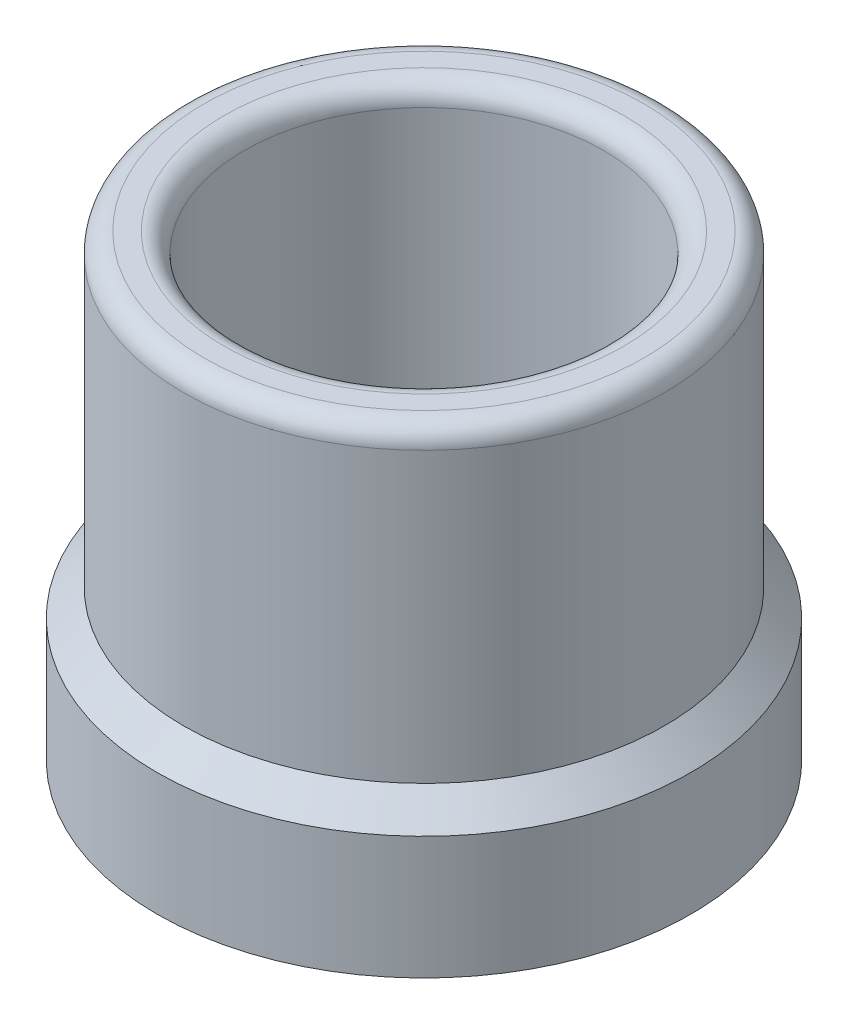
ISO-10303-21;
HEADER;
FILE_DESCRIPTION(('STEP AP214'),'2;1');
FILE_NAME('part.step','',(''),(''),'','','');
FILE_SCHEMA(('AUTOMOTIVE_DESIGN { 1 0 10303 214 1 1 1 1 }'));
ENDSEC;
DATA;
#1=APPLICATION_CONTEXT('core data for automotive mechanical design processes');
#2=APPLICATION_PROTOCOL_DEFINITION('international standard','automotive_design',2000,#1);
#3=PRODUCT_CONTEXT('',#1,'mechanical');
#4=PRODUCT('Part','Part','',(#3));
#5=PRODUCT_RELATED_PRODUCT_CATEGORY('part','',(#4));
#6=PRODUCT_DEFINITION_FORMATION('','',#4);
#7=PRODUCT_DEFINITION_CONTEXT('part definition',#1,'design');
#8=PRODUCT_DEFINITION('design','',#6,#7);
#9=PRODUCT_DEFINITION_SHAPE('','',#8);
#10=(LENGTH_UNIT() NAMED_UNIT(*) SI_UNIT(.MILLI.,.METRE.));
#11=(NAMED_UNIT(*) PLANE_ANGLE_UNIT() SI_UNIT($,.RADIAN.));
#12=(NAMED_UNIT(*) SI_UNIT($,.STERADIAN.) SOLID_ANGLE_UNIT());
#13=UNCERTAINTY_MEASURE_WITH_UNIT(LENGTH_MEASURE(1.E-05),#10,'distance_accuracy_value','');
#14=(GEOMETRIC_REPRESENTATION_CONTEXT(3) GLOBAL_UNCERTAINTY_ASSIGNED_CONTEXT((#13)) GLOBAL_UNIT_ASSIGNED_CONTEXT((#10,
#11,#12)) REPRESENTATION_CONTEXT('',''));
#15=CARTESIAN_POINT('',(0.,0.,0.));
#16=DIRECTION('',(0.,0.,1.));
#17=DIRECTION('',(1.,0.,0.));
#18=AXIS2_PLACEMENT_3D('',#15,#16,#17);
#19=CARTESIAN_POINT('',(-26.,94.7,-3.5));
#20=DIRECTION('',(0.,-1.,0.));
#21=DIRECTION('',(0.,0.,-1.));
#22=AXIS2_PLACEMENT_3D('',#19,#20,#21);
#23=TOROIDAL_SURFACE('',#22,4.60870569763346,0.5);
#24=CARTESIAN_POINT('',(-26.,94.7,-3.5));
#25=DIRECTION('',(0.,-1.,0.));
#26=DIRECTION('',(0.,0.,-1.));
#27=AXIS2_PLACEMENT_3D('',#24,#25,#26);
#28=CIRCLE('',#27,4.10870569763346);
#29=CARTESIAN_POINT('',(-26.,94.7,-7.60870569763345));
#30=VERTEX_POINT('',#29);
#31=EDGE_CURVE('E291',#30,#30,#28,.T.);
#32=ORIENTED_EDGE('',*,*,#31,.F.);
#33=EDGE_LOOP('',(#32));
#34=FACE_BOUND('',#33,.T.);
#35=CARTESIAN_POINT('',(-26.,94.7,-3.5));
#36=DIRECTION('',(0.,-1.,0.));
#37=DIRECTION('',(0.,0.,-1.));
#38=AXIS2_PLACEMENT_3D('',#35,#36,#37);
#39=CIRCLE('',#38,5.10870569763346);
#40=CARTESIAN_POINT('',(-26.,94.7,-8.60870569763346));
#41=VERTEX_POINT('',#40);
#42=EDGE_CURVE('E101',#41,#41,#39,.T.);
#43=ORIENTED_EDGE('',*,*,#42,.T.);
#44=EDGE_LOOP('',(#43));
#45=FACE_BOUND('',#44,.T.);
#46=ADVANCED_FACE('F47',(#34,#45),#23,.F.);
#47=CARTESIAN_POINT('',(-26.,90.5,-3.5));
#48=DIRECTION('',(0.,-1.,0.));
#49=DIRECTION('',(0.,0.,-1.));
#50=AXIS2_PLACEMENT_3D('',#47,#48,#49);
#51=CYLINDRICAL_SURFACE('',#50,5.10870569763346);
#52=CARTESIAN_POINT('',(-26.,92.5,-3.5));
#53=DIRECTION('',(0.,-1.,0.));
#54=DIRECTION('',(0.,0.,-1.));
#55=AXIS2_PLACEMENT_3D('',#52,#53,#54);
#56=CIRCLE('',#55,5.10870569763346);
#57=CARTESIAN_POINT('',(-26.,92.5,-8.60870569763346));
#58=VERTEX_POINT('',#57);
#59=EDGE_CURVE('E105',#58,#58,#56,.T.);
#60=ORIENTED_EDGE('',*,*,#59,.T.);
#61=EDGE_LOOP('',(#60));
#62=FACE_BOUND('',#61,.T.);
#63=ORIENTED_EDGE('',*,*,#42,.F.);
#64=EDGE_LOOP('',(#63));
#65=FACE_BOUND('',#64,.T.);
#66=ADVANCED_FACE('F139',(#62,#65),#51,.F.);
#67=CARTESIAN_POINT('',(-26.,93.5,-3.5));
#68=DIRECTION('',(0.,-1.,0.));
#69=DIRECTION('',(0.,0.,-1.));
#70=AXIS2_PLACEMENT_3D('',#67,#68,#69);
#71=TOROIDAL_SURFACE('',#70,5.85870569763346,1.25);
#72=ORIENTED_EDGE('',*,*,#59,.F.);
#73=EDGE_LOOP('',(#72));
#74=FACE_BOUND('',#73,.T.);
#75=CARTESIAN_POINT('',(-26.,92.5,-3.5));
#76=DIRECTION('',(0.,-1.,0.));
#77=DIRECTION('',(0.,0.,-1.));
#78=AXIS2_PLACEMENT_3D('',#75,#76,#77);
#79=CIRCLE('',#78,6.60870569763346);
#80=CARTESIAN_POINT('',(-26.,92.5,-10.1087056976335));
#81=VERTEX_POINT('',#80);
#82=EDGE_CURVE('E109',#81,#81,#79,.T.);
#83=ORIENTED_EDGE('',*,*,#82,.T.);
#84=EDGE_LOOP('',(#83));
#85=FACE_BOUND('',#84,.T.);
#86=ADVANCED_FACE('F145',(#74,#85),#71,.T.);
#87=CARTESIAN_POINT('',(-26.,90.5,-3.5));
#88=DIRECTION('',(0.,-1.,0.));
#89=DIRECTION('',(0.,0.,-1.));
#90=AXIS2_PLACEMENT_3D('',#87,#88,#89);
#91=CYLINDRICAL_SURFACE('',#90,6.60870569763346);
#92=ORIENTED_EDGE('',*,*,#82,.F.);
#93=EDGE_LOOP('',(#92));
#94=FACE_BOUND('',#93,.T.);
#95=CARTESIAN_POINT('',(-26.,95.5362943023666,-3.5));
#96=DIRECTION('',(0.,-1.,0.));
#97=DIRECTION('',(0.,0.,-1.));
#98=AXIS2_PLACEMENT_3D('',#95,#96,#97);
#99=CIRCLE('',#98,6.60870569763346);
#100=CARTESIAN_POINT('',(-26.,95.5362943023666,-10.1087056976335));
#101=VERTEX_POINT('',#100);
#102=EDGE_CURVE('E113',#101,#101,#99,.T.);
#103=ORIENTED_EDGE('',*,*,#102,.T.);
#104=EDGE_LOOP('',(#103));
#105=FACE_BOUND('',#104,.T.);
#106=ADVANCED_FACE('F134',(#94,#105),#91,.T.);
#107=CARTESIAN_POINT('',(-26.,96.2,-3.5));
#108=DIRECTION('',(0.,-1.,0.));
#109=DIRECTION('',(0.,0.,-1.));
#110=AXIS2_PLACEMENT_3D('',#107,#108,#109);
#111=CONICAL_SURFACE('',#110,5.945,0.785398163397464);
#112=ORIENTED_EDGE('',*,*,#102,.F.);
#113=EDGE_LOOP('',(#112));
#114=FACE_BOUND('',#113,.T.);
#115=CARTESIAN_POINT('',(-26.,96.2,-3.5));
#116=DIRECTION('',(0.,-1.,0.));
#117=DIRECTION('',(0.,0.,-1.));
#118=AXIS2_PLACEMENT_3D('',#115,#116,#117);
#119=CIRCLE('',#118,5.945);
#120=CARTESIAN_POINT('',(-26.,96.2,-9.445));
#121=VERTEX_POINT('',#120);
#122=EDGE_CURVE('E97',#121,#121,#119,.T.);
#123=ORIENTED_EDGE('',*,*,#122,.T.);
#124=EDGE_LOOP('',(#123));
#125=FACE_BOUND('',#124,.T.);
#126=ADVANCED_FACE('F121',(#114,#125),#111,.T.);
#127=CARTESIAN_POINT('',(-26.,90.5,-3.5));
#128=DIRECTION('',(0.,-1.,0.));
#129=DIRECTION('',(0.,0.,-1.));
#130=AXIS2_PLACEMENT_3D('',#127,#128,#129);
#131=CYLINDRICAL_SURFACE('',#130,5.945);
#132=CARTESIAN_POINT('',(-26.,103.3368,-3.5));
#133=DIRECTION('',(0.,-1.,0.));
#134=DIRECTION('',(0.,0.,-1.));
#135=AXIS2_PLACEMENT_3D('',#132,#133,#134);
#136=CIRCLE('',#135,5.945);
#137=CARTESIAN_POINT('',(-26.,103.3368,-9.445));
#138=VERTEX_POINT('',#137);
#139=EDGE_CURVE('E11',#138,#138,#136,.T.);
#140=ORIENTED_EDGE('',*,*,#139,.T.);
#141=EDGE_LOOP('',(#140));
#142=FACE_BOUND('',#141,.T.);
#143=ORIENTED_EDGE('',*,*,#122,.F.);
#144=EDGE_LOOP('',(#143));
#145=FACE_BOUND('',#144,.T.);
#146=ADVANCED_FACE('F123',(#142,#145),#131,.T.);
#147=CARTESIAN_POINT('',(0.,103.8368,-3.5));
#148=DIRECTION('',(0.,-1.,0.));
#149=DIRECTION('',(0.,0.,-1.));
#150=AXIS2_PLACEMENT_3D('',#147,#148,#149);
#151=PLANE('',#150);
#152=CARTESIAN_POINT('',(-26.,103.8368,-3.5));
#153=DIRECTION('',(0.,-1.,0.));
#154=DIRECTION('',(0.,0.,-1.));
#155=AXIS2_PLACEMENT_3D('',#152,#153,#154);
#156=CIRCLE('',#155,4.945);
#157=CARTESIAN_POINT('',(-26.,103.8368,-8.445));
#158=VERTEX_POINT('',#157);
#159=EDGE_CURVE('E64',#158,#158,#156,.T.);
#160=ORIENTED_EDGE('',*,*,#159,.T.);
#161=EDGE_LOOP('',(#160));
#162=FACE_BOUND('',#161,.T.);
#163=CARTESIAN_POINT('',(-26.,103.8368,-3.5));
#164=DIRECTION('',(0.,-1.,0.));
#165=DIRECTION('',(0.,0.,-1.));
#166=AXIS2_PLACEMENT_3D('',#163,#164,#165);
#167=CIRCLE('',#166,5.445);
#168=CARTESIAN_POINT('',(-26.,103.8368,-8.945));
#169=VERTEX_POINT('',#168);
#170=EDGE_CURVE('E70',#169,#169,#167,.F.);
#171=ORIENTED_EDGE('',*,*,#170,.T.);
#172=EDGE_LOOP('',(#171));
#173=FACE_BOUND('',#172,.T.);
#174=ADVANCED_FACE('F125',(#162,#173),#151,.F.);
#175=CARTESIAN_POINT('',(-26.,90.5,-3.5));
#176=DIRECTION('',(0.,-1.,0.));
#177=DIRECTION('',(0.,0.,-1.));
#178=AXIS2_PLACEMENT_3D('',#175,#176,#177);
#179=CYLINDRICAL_SURFACE('',#178,4.445);
#180=CARTESIAN_POINT('',(-26.,103.3368,-3.5));
#181=DIRECTION('',(0.,-1.,0.));
#182=DIRECTION('',(0.,0.,-1.));
#183=AXIS2_PLACEMENT_3D('',#180,#181,#182);
#184=CIRCLE('',#183,4.445);
#185=CARTESIAN_POINT('',(-26.,103.3368,-7.945));
#186=VERTEX_POINT('',#185);
#187=EDGE_CURVE('E57',#186,#186,#184,.F.);
#188=ORIENTED_EDGE('',*,*,#187,.T.);
#189=EDGE_LOOP('',(#188));
#190=FACE_BOUND('',#189,.T.);
#191=CARTESIAN_POINT('',(-26.,96.7375,-3.5));
#192=DIRECTION('',(0.,-1.,0.));
#193=DIRECTION('',(0.,0.,-1.));
#194=AXIS2_PLACEMENT_3D('',#191,#192,#193);
#195=CIRCLE('',#194,4.445);
#196=CARTESIAN_POINT('',(-26.,96.7375,-7.945));
#197=VERTEX_POINT('',#196);
#198=EDGE_CURVE('E90',#197,#197,#195,.T.);
#199=ORIENTED_EDGE('',*,*,#198,.T.);
#200=EDGE_LOOP('',(#199));
#201=FACE_BOUND('',#200,.T.);
#202=ADVANCED_FACE('F131',(#190,#201),#179,.F.);
#203=CARTESIAN_POINT('',(0.,96.7375,-3.5));
#204=DIRECTION('',(0.,1.,0.));
#205=DIRECTION('',(0.,0.,1.));
#206=AXIS2_PLACEMENT_3D('',#203,#204,#205);
#207=PLANE('',#206);
#208=CARTESIAN_POINT('',(-26.,96.7375,-3.5));
#209=DIRECTION('',(0.,-1.,0.));
#210=DIRECTION('',(0.,0.,-1.));
#211=AXIS2_PLACEMENT_3D('',#208,#209,#210);
#212=CIRCLE('',#211,3.32436096721845);
#213=CARTESIAN_POINT('',(-26.,96.7375,-6.82436096721845));
#214=VERTEX_POINT('',#213);
#215=EDGE_CURVE('E84',#214,#214,#212,.T.);
#216=ORIENTED_EDGE('',*,*,#215,.T.);
#217=EDGE_LOOP('',(#216));
#218=FACE_BOUND('',#217,.T.);
#219=ORIENTED_EDGE('',*,*,#198,.F.);
#220=EDGE_LOOP('',(#219));
#221=FACE_BOUND('',#220,.T.);
#222=ADVANCED_FACE('F177',(#218,#221),#207,.T.);
#223=CARTESIAN_POINT('',(-26.,90.5,-3.5));
#224=DIRECTION('',(0.,-1.,0.));
#225=DIRECTION('',(0.,0.,-1.));
#226=AXIS2_PLACEMENT_3D('',#223,#224,#225);
#227=CYLINDRICAL_SURFACE('',#226,3.32436096721845);
#228=CARTESIAN_POINT('',(-26.,94.7,-3.5));
#229=DIRECTION('',(0.,-1.,0.));
#230=DIRECTION('',(0.,0.,-1.));
#231=AXIS2_PLACEMENT_3D('',#228,#229,#230);
#232=CIRCLE('',#231,3.32436096721845);
#233=CARTESIAN_POINT('',(-26.,94.7,-6.82436096721845));
#234=VERTEX_POINT('',#233);
#235=EDGE_CURVE('E91',#234,#234,#232,.T.);
#236=ORIENTED_EDGE('',*,*,#235,.T.);
#237=EDGE_LOOP('',(#236));
#238=FACE_BOUND('',#237,.T.);
#239=ORIENTED_EDGE('',*,*,#215,.F.);
#240=EDGE_LOOP('',(#239));
#241=FACE_BOUND('',#240,.T.);
#242=ADVANCED_FACE('F165',(#238,#241),#227,.F.);
#243=CARTESIAN_POINT('',(0.,94.7,-3.5));
#244=DIRECTION('',(0.,-1.,0.));
#245=DIRECTION('',(0.,0.,-1.));
#246=AXIS2_PLACEMENT_3D('',#243,#244,#245);
#247=PLANE('',#246);
#248=ORIENTED_EDGE('',*,*,#31,.T.);
#249=EDGE_LOOP('',(#248));
#250=FACE_BOUND('',#249,.T.);
#251=ORIENTED_EDGE('',*,*,#235,.F.);
#252=EDGE_LOOP('',(#251));
#253=FACE_BOUND('',#252,.T.);
#254=ADVANCED_FACE('F158',(#250,#253),#247,.T.);
#255=CARTESIAN_POINT('',(-26.,103.3368,-3.5));
#256=DIRECTION('',(0.,-1.,0.));
#257=DIRECTION('',(0.,0.,-1.));
#258=AXIS2_PLACEMENT_3D('',#255,#256,#257);
#259=TOROIDAL_SURFACE('',#258,4.945,0.5);
#260=ORIENTED_EDGE('',*,*,#187,.F.);
#261=EDGE_LOOP('',(#260));
#262=FACE_BOUND('',#261,.T.);
#263=ORIENTED_EDGE('',*,*,#159,.F.);
#264=EDGE_LOOP('',(#263));
#265=FACE_BOUND('',#264,.T.);
#266=ADVANCED_FACE('F156',(#262,#265),#259,.T.);
#267=CARTESIAN_POINT('',(-26.,103.3368,-3.5));
#268=DIRECTION('',(0.,-1.,0.));
#269=DIRECTION('',(0.,0.,-1.));
#270=AXIS2_PLACEMENT_3D('',#267,#268,#269);
#271=TOROIDAL_SURFACE('',#270,5.445,0.5);
#272=ORIENTED_EDGE('',*,*,#170,.F.);
#273=EDGE_LOOP('',(#272));
#274=FACE_BOUND('',#273,.T.);
#275=ORIENTED_EDGE('',*,*,#139,.F.);
#276=EDGE_LOOP('',(#275));
#277=FACE_BOUND('',#276,.T.);
#278=ADVANCED_FACE('F50',(#274,#277),#271,.T.);
#279=CLOSED_SHELL('',(#46,#66,#86,#106,#126,#146,#174,#202,#222,#242,#254,#266,#278));
#280=MANIFOLD_SOLID_BREP('B2',#279);
#281=ADVANCED_BREP_SHAPE_REPRESENTATION('',(#18,#280),#14);
#282=SHAPE_DEFINITION_REPRESENTATION(#9,#281);
ENDSEC;
END-ISO-10303-21;
